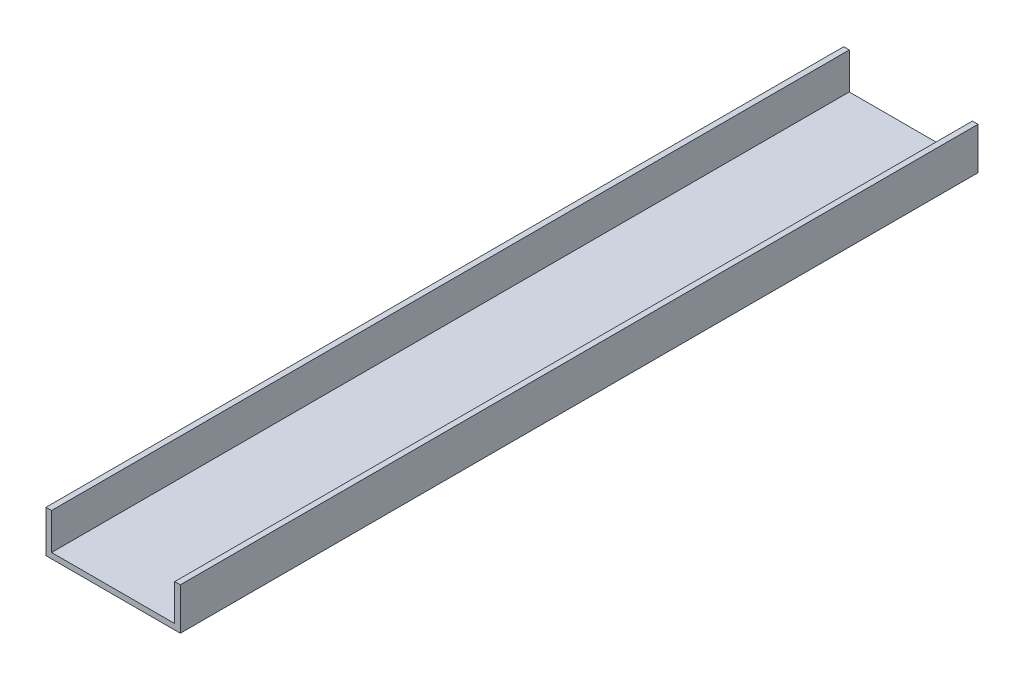
ISO-10303-21;
HEADER;
FILE_DESCRIPTION(('STEP AP214'),'2;1');
FILE_NAME('part.step','',(''),(''),'','','');
FILE_SCHEMA(('AUTOMOTIVE_DESIGN { 1 0 10303 214 1 1 1 1 }'));
ENDSEC;
DATA;
#1=APPLICATION_CONTEXT('core data for automotive mechanical design processes');
#2=APPLICATION_PROTOCOL_DEFINITION('international standard','automotive_design',2000,#1);
#3=PRODUCT_CONTEXT('',#1,'mechanical');
#4=PRODUCT('Part','Part','',(#3));
#5=PRODUCT_RELATED_PRODUCT_CATEGORY('part','',(#4));
#6=PRODUCT_DEFINITION_FORMATION('','',#4);
#7=PRODUCT_DEFINITION_CONTEXT('part definition',#1,'design');
#8=PRODUCT_DEFINITION('design','',#6,#7);
#9=PRODUCT_DEFINITION_SHAPE('','',#8);
#10=(LENGTH_UNIT() NAMED_UNIT(*) SI_UNIT(.MILLI.,.METRE.));
#11=(NAMED_UNIT(*) PLANE_ANGLE_UNIT() SI_UNIT($,.RADIAN.));
#12=(NAMED_UNIT(*) SI_UNIT($,.STERADIAN.) SOLID_ANGLE_UNIT());
#13=UNCERTAINTY_MEASURE_WITH_UNIT(LENGTH_MEASURE(1.E-05),#10,'distance_accuracy_value','');
#14=(GEOMETRIC_REPRESENTATION_CONTEXT(3) GLOBAL_UNCERTAINTY_ASSIGNED_CONTEXT((#13)) GLOBAL_UNIT_ASSIGNED_CONTEXT((#10,
#11,#12)) REPRESENTATION_CONTEXT('',''));
#15=CARTESIAN_POINT('',(0.,0.,0.));
#16=DIRECTION('',(0.,0.,1.));
#17=DIRECTION('',(1.,0.,0.));
#18=AXIS2_PLACEMENT_3D('',#15,#16,#17);
#19=CARTESIAN_POINT('',(2.,0.,285.));
#20=DIRECTION('',(-1.,0.,0.));
#21=DIRECTION('',(0.,0.,1.));
#22=AXIS2_PLACEMENT_3D('',#19,#20,#21);
#23=PLANE('',#22);
#24=DIRECTION('',(0.,1.,0.));
#25=VECTOR('',#24,1.);
#26=CARTESIAN_POINT('',(2.,0.,0.));
#27=LINE('',#26,#25);
#28=CARTESIAN_POINT('',(2.,2.,0.));
#29=VERTEX_POINT('',#28);
#30=CARTESIAN_POINT('',(2.,15.,0.));
#31=VERTEX_POINT('',#30);
#32=EDGE_CURVE('E130',#29,#31,#27,.T.);
#33=ORIENTED_EDGE('',*,*,#32,.T.);
#34=DIRECTION('',(0.,0.,-1.));
#35=VECTOR('',#34,1.);
#36=CARTESIAN_POINT('',(2.,15.,285.));
#37=LINE('',#36,#35);
#38=CARTESIAN_POINT('',(2.,15.,285.));
#39=VERTEX_POINT('',#38);
#40=EDGE_CURVE('E11',#39,#31,#37,.T.);
#41=ORIENTED_EDGE('',*,*,#40,.F.);
#42=DIRECTION('',(0.,1.,0.));
#43=VECTOR('',#42,1.);
#44=CARTESIAN_POINT('',(2.,0.,285.));
#45=LINE('',#44,#43);
#46=CARTESIAN_POINT('',(2.,2.,285.));
#47=VERTEX_POINT('',#46);
#48=EDGE_CURVE('E88',#47,#39,#45,.T.);
#49=ORIENTED_EDGE('',*,*,#48,.F.);
#50=DIRECTION('',(0.,0.,-1.));
#51=VECTOR('',#50,1.);
#52=CARTESIAN_POINT('',(2.,2.,285.));
#53=LINE('',#52,#51);
#54=EDGE_CURVE('E129',#47,#29,#53,.T.);
#55=ORIENTED_EDGE('',*,*,#54,.T.);
#56=EDGE_LOOP('',(#33,#41,#49,#55));
#57=FACE_BOUND('',#56,.T.);
#58=ADVANCED_FACE('F33',(#57),#23,.F.);
#59=CARTESIAN_POINT('',(0.,15.,285.));
#60=DIRECTION('',(0.,1.,0.));
#61=DIRECTION('',(0.,0.,1.));
#62=AXIS2_PLACEMENT_3D('',#59,#60,#61);
#63=PLANE('',#62);
#64=DIRECTION('',(1.,0.,0.));
#65=VECTOR('',#64,1.);
#66=CARTESIAN_POINT('',(0.,15.,0.));
#67=LINE('',#66,#65);
#68=CARTESIAN_POINT('',(0.,15.,0.));
#69=VERTEX_POINT('',#68);
#70=EDGE_CURVE('E133',#69,#31,#67,.T.);
#71=ORIENTED_EDGE('',*,*,#70,.F.);
#72=DIRECTION('',(0.,0.,-1.));
#73=VECTOR('',#72,1.);
#74=CARTESIAN_POINT('',(0.,15.,285.));
#75=LINE('',#74,#73);
#76=CARTESIAN_POINT('',(0.,15.,285.));
#77=VERTEX_POINT('',#76);
#78=EDGE_CURVE('E41',#77,#69,#75,.T.);
#79=ORIENTED_EDGE('',*,*,#78,.F.);
#80=DIRECTION('',(1.,0.,0.));
#81=VECTOR('',#80,1.);
#82=CARTESIAN_POINT('',(0.,15.,285.));
#83=LINE('',#82,#81);
#84=EDGE_CURVE('E172',#77,#39,#83,.T.);
#85=ORIENTED_EDGE('',*,*,#84,.T.);
#86=ORIENTED_EDGE('',*,*,#40,.T.);
#87=EDGE_LOOP('',(#71,#79,#85,#86));
#88=FACE_BOUND('',#87,.T.);
#89=ADVANCED_FACE('F163',(#88),#63,.T.);
#90=CARTESIAN_POINT('',(0.,0.,285.));
#91=DIRECTION('',(-1.,0.,0.));
#92=DIRECTION('',(0.,0.,1.));
#93=AXIS2_PLACEMENT_3D('',#90,#91,#92);
#94=PLANE('',#93);
#95=DIRECTION('',(0.,1.,0.));
#96=VECTOR('',#95,1.);
#97=CARTESIAN_POINT('',(0.,0.,0.));
#98=LINE('',#97,#96);
#99=CARTESIAN_POINT('',(0.,0.,0.));
#100=VERTEX_POINT('',#99);
#101=EDGE_CURVE('E136',#100,#69,#98,.T.);
#102=ORIENTED_EDGE('',*,*,#101,.F.);
#103=DIRECTION('',(0.,0.,-1.));
#104=VECTOR('',#103,1.);
#105=CARTESIAN_POINT('',(0.,0.,285.));
#106=LINE('',#105,#104);
#107=CARTESIAN_POINT('',(0.,0.,285.));
#108=VERTEX_POINT('',#107);
#109=EDGE_CURVE('E153',#108,#100,#106,.T.);
#110=ORIENTED_EDGE('',*,*,#109,.F.);
#111=DIRECTION('',(0.,1.,0.));
#112=VECTOR('',#111,1.);
#113=CARTESIAN_POINT('',(0.,0.,285.));
#114=LINE('',#113,#112);
#115=EDGE_CURVE('E160',#108,#77,#114,.T.);
#116=ORIENTED_EDGE('',*,*,#115,.T.);
#117=ORIENTED_EDGE('',*,*,#78,.T.);
#118=EDGE_LOOP('',(#102,#110,#116,#117));
#119=FACE_BOUND('',#118,.T.);
#120=ADVANCED_FACE('F158',(#119),#94,.T.);
#121=CARTESIAN_POINT('',(0.,0.,285.));
#122=DIRECTION('',(0.,-1.,0.));
#123=DIRECTION('',(0.,0.,-1.));
#124=AXIS2_PLACEMENT_3D('',#121,#122,#123);
#125=PLANE('',#124);
#126=DIRECTION('',(-1.,0.,0.));
#127=VECTOR('',#126,1.);
#128=CARTESIAN_POINT('',(0.,0.,0.));
#129=LINE('',#128,#127);
#130=CARTESIAN_POINT('',(48.,0.,0.));
#131=VERTEX_POINT('',#130);
#132=EDGE_CURVE('E139',#131,#100,#129,.T.);
#133=ORIENTED_EDGE('',*,*,#132,.F.);
#134=DIRECTION('',(0.,0.,-1.));
#135=VECTOR('',#134,1.);
#136=CARTESIAN_POINT('',(48.,0.,285.));
#137=LINE('',#136,#135);
#138=CARTESIAN_POINT('',(48.,0.,285.));
#139=VERTEX_POINT('',#138);
#140=EDGE_CURVE('E151',#139,#131,#137,.T.);
#141=ORIENTED_EDGE('',*,*,#140,.F.);
#142=DIRECTION('',(-1.,0.,0.));
#143=VECTOR('',#142,1.);
#144=CARTESIAN_POINT('',(0.,0.,285.));
#145=LINE('',#144,#143);
#146=EDGE_CURVE('E124',#139,#108,#145,.T.);
#147=ORIENTED_EDGE('',*,*,#146,.T.);
#148=ORIENTED_EDGE('',*,*,#109,.T.);
#149=EDGE_LOOP('',(#133,#141,#147,#148));
#150=FACE_BOUND('',#149,.T.);
#151=ADVANCED_FACE('F170',(#150),#125,.T.);
#152=CARTESIAN_POINT('',(48.,0.,285.));
#153=DIRECTION('',(1.,0.,0.));
#154=DIRECTION('',(0.,0.,-1.));
#155=AXIS2_PLACEMENT_3D('',#152,#153,#154);
#156=PLANE('',#155);
#157=DIRECTION('',(0.,-1.,0.));
#158=VECTOR('',#157,1.);
#159=CARTESIAN_POINT('',(48.,0.,0.));
#160=LINE('',#159,#158);
#161=CARTESIAN_POINT('',(48.,15.,0.));
#162=VERTEX_POINT('',#161);
#163=EDGE_CURVE('E142',#162,#131,#160,.T.);
#164=ORIENTED_EDGE('',*,*,#163,.F.);
#165=DIRECTION('',(0.,0.,-1.));
#166=VECTOR('',#165,1.);
#167=CARTESIAN_POINT('',(48.,15.,285.));
#168=LINE('',#167,#166);
#169=CARTESIAN_POINT('',(48.,15.,285.));
#170=VERTEX_POINT('',#169);
#171=EDGE_CURVE('E112',#170,#162,#168,.T.);
#172=ORIENTED_EDGE('',*,*,#171,.F.);
#173=DIRECTION('',(0.,-1.,0.));
#174=VECTOR('',#173,1.);
#175=CARTESIAN_POINT('',(48.,0.,285.));
#176=LINE('',#175,#174);
#177=EDGE_CURVE('E122',#170,#139,#176,.T.);
#178=ORIENTED_EDGE('',*,*,#177,.T.);
#179=ORIENTED_EDGE('',*,*,#140,.T.);
#180=EDGE_LOOP('',(#164,#172,#178,#179));
#181=FACE_BOUND('',#180,.T.);
#182=ADVANCED_FACE('F177',(#181),#156,.T.);
#183=CARTESIAN_POINT('',(46.,15.,285.));
#184=DIRECTION('',(0.,1.,0.));
#185=DIRECTION('',(0.,0.,1.));
#186=AXIS2_PLACEMENT_3D('',#183,#184,#185);
#187=PLANE('',#186);
#188=DIRECTION('',(1.,0.,0.));
#189=VECTOR('',#188,1.);
#190=CARTESIAN_POINT('',(46.,15.,0.));
#191=LINE('',#190,#189);
#192=CARTESIAN_POINT('',(46.,15.,0.));
#193=VERTEX_POINT('',#192);
#194=EDGE_CURVE('E111',#193,#162,#191,.T.);
#195=ORIENTED_EDGE('',*,*,#194,.F.);
#196=DIRECTION('',(0.,0.,-1.));
#197=VECTOR('',#196,1.);
#198=CARTESIAN_POINT('',(46.,15.,285.));
#199=LINE('',#198,#197);
#200=CARTESIAN_POINT('',(46.,15.,285.));
#201=VERTEX_POINT('',#200);
#202=EDGE_CURVE('E105',#201,#193,#199,.T.);
#203=ORIENTED_EDGE('',*,*,#202,.F.);
#204=DIRECTION('',(1.,0.,0.));
#205=VECTOR('',#204,1.);
#206=CARTESIAN_POINT('',(46.,15.,285.));
#207=LINE('',#206,#205);
#208=EDGE_CURVE('E109',#201,#170,#207,.T.);
#209=ORIENTED_EDGE('',*,*,#208,.T.);
#210=ORIENTED_EDGE('',*,*,#171,.T.);
#211=EDGE_LOOP('',(#195,#203,#209,#210));
#212=FACE_BOUND('',#211,.T.);
#213=ADVANCED_FACE('F107',(#212),#187,.T.);
#214=CARTESIAN_POINT('',(46.,0.,285.));
#215=DIRECTION('',(1.,0.,0.));
#216=DIRECTION('',(0.,0.,-1.));
#217=AXIS2_PLACEMENT_3D('',#214,#215,#216);
#218=PLANE('',#217);
#219=DIRECTION('',(0.,1.,0.));
#220=VECTOR('',#219,1.);
#221=CARTESIAN_POINT('',(46.,0.,0.));
#222=LINE('',#221,#220);
#223=CARTESIAN_POINT('',(46.,2.,0.));
#224=VERTEX_POINT('',#223);
#225=EDGE_CURVE('E76',#193,#224,#222,.F.);
#226=ORIENTED_EDGE('',*,*,#225,.T.);
#227=DIRECTION('',(0.,0.,-1.));
#228=VECTOR('',#227,1.);
#229=CARTESIAN_POINT('',(46.,2.,285.));
#230=LINE('',#229,#228);
#231=CARTESIAN_POINT('',(46.,2.,285.));
#232=VERTEX_POINT('',#231);
#233=EDGE_CURVE('E113',#232,#224,#230,.T.);
#234=ORIENTED_EDGE('',*,*,#233,.F.);
#235=DIRECTION('',(0.,1.,0.));
#236=VECTOR('',#235,1.);
#237=CARTESIAN_POINT('',(46.,0.,285.));
#238=LINE('',#237,#236);
#239=EDGE_CURVE('E115',#201,#232,#238,.F.);
#240=ORIENTED_EDGE('',*,*,#239,.F.);
#241=ORIENTED_EDGE('',*,*,#202,.T.);
#242=EDGE_LOOP('',(#226,#234,#240,#241));
#243=FACE_BOUND('',#242,.T.);
#244=ADVANCED_FACE('F116',(#243),#218,.F.);
#245=CARTESIAN_POINT('',(0.,2.,285.));
#246=DIRECTION('',(0.,-1.,0.));
#247=DIRECTION('',(0.,0.,-1.));
#248=AXIS2_PLACEMENT_3D('',#245,#246,#247);
#249=PLANE('',#248);
#250=DIRECTION('',(1.,0.,0.));
#251=VECTOR('',#250,1.);
#252=CARTESIAN_POINT('',(0.,2.,0.));
#253=LINE('',#252,#251);
#254=EDGE_CURVE('E82',#224,#29,#253,.F.);
#255=ORIENTED_EDGE('',*,*,#254,.T.);
#256=ORIENTED_EDGE('',*,*,#54,.F.);
#257=DIRECTION('',(1.,0.,0.));
#258=VECTOR('',#257,1.);
#259=CARTESIAN_POINT('',(0.,2.,285.));
#260=LINE('',#259,#258);
#261=EDGE_CURVE('E49',#232,#47,#260,.F.);
#262=ORIENTED_EDGE('',*,*,#261,.F.);
#263=ORIENTED_EDGE('',*,*,#233,.T.);
#264=EDGE_LOOP('',(#255,#256,#262,#263));
#265=FACE_BOUND('',#264,.T.);
#266=ADVANCED_FACE('F179',(#265),#249,.F.);
#267=CARTESIAN_POINT('',(0.,0.,285.));
#268=DIRECTION('',(0.,0.,-1.));
#269=DIRECTION('',(-1.,0.,0.));
#270=AXIS2_PLACEMENT_3D('',#267,#268,#269);
#271=PLANE('',#270);
#272=ORIENTED_EDGE('',*,*,#48,.T.);
#273=ORIENTED_EDGE('',*,*,#84,.F.);
#274=ORIENTED_EDGE('',*,*,#115,.F.);
#275=ORIENTED_EDGE('',*,*,#146,.F.);
#276=ORIENTED_EDGE('',*,*,#177,.F.);
#277=ORIENTED_EDGE('',*,*,#208,.F.);
#278=ORIENTED_EDGE('',*,*,#239,.T.);
#279=ORIENTED_EDGE('',*,*,#261,.T.);
#280=EDGE_LOOP('',(#272,#273,#274,#275,#276,#277,#278,#279));
#281=FACE_BOUND('',#280,.T.);
#282=ADVANCED_FACE('F119',(#281),#271,.F.);
#283=CARTESIAN_POINT('',(0.,0.,0.));
#284=DIRECTION('',(0.,0.,-1.));
#285=DIRECTION('',(-1.,0.,0.));
#286=AXIS2_PLACEMENT_3D('',#283,#284,#285);
#287=PLANE('',#286);
#288=ORIENTED_EDGE('',*,*,#32,.F.);
#289=ORIENTED_EDGE('',*,*,#254,.F.);
#290=ORIENTED_EDGE('',*,*,#225,.F.);
#291=ORIENTED_EDGE('',*,*,#194,.T.);
#292=ORIENTED_EDGE('',*,*,#163,.T.);
#293=ORIENTED_EDGE('',*,*,#132,.T.);
#294=ORIENTED_EDGE('',*,*,#101,.T.);
#295=ORIENTED_EDGE('',*,*,#70,.T.);
#296=EDGE_LOOP('',(#288,#289,#290,#291,#292,#293,#294,#295));
#297=FACE_BOUND('',#296,.T.);
#298=ADVANCED_FACE('F166',(#297),#287,.T.);
#299=CLOSED_SHELL('',(#58,#89,#120,#151,#182,#213,#244,#266,#282,#298));
#300=MANIFOLD_SOLID_BREP('B2',#299);
#301=ADVANCED_BREP_SHAPE_REPRESENTATION('',(#18,#300),#14);
#302=SHAPE_DEFINITION_REPRESENTATION(#9,#301);
ENDSEC;
END-ISO-10303-21;
